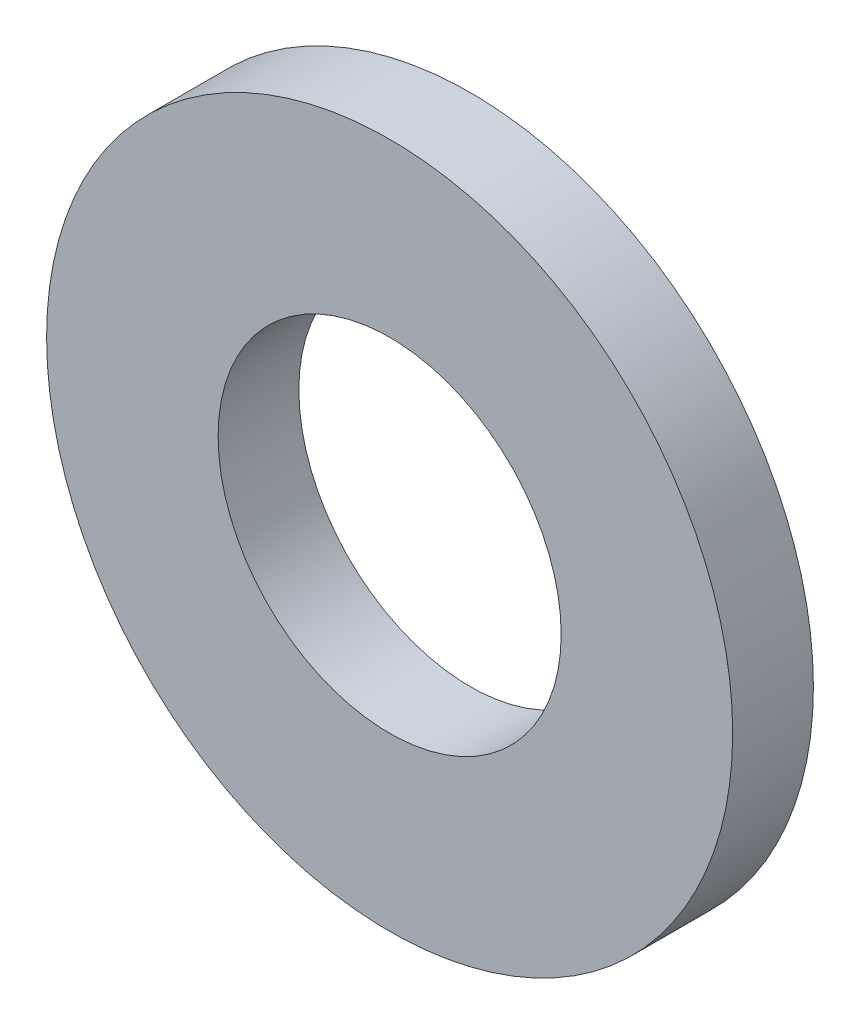
ISO-10303-21;
HEADER;
FILE_DESCRIPTION(('STEP AP214'),'2;1');
FILE_NAME('part.step','',(''),(''),'','','');
FILE_SCHEMA(('AUTOMOTIVE_DESIGN { 1 0 10303 214 1 1 1 1 }'));
ENDSEC;
DATA;
#1=APPLICATION_CONTEXT('core data for automotive mechanical design processes');
#2=APPLICATION_PROTOCOL_DEFINITION('international standard','automotive_design',2000,#1);
#3=PRODUCT_CONTEXT('',#1,'mechanical');
#4=PRODUCT('Part','Part','',(#3));
#5=PRODUCT_RELATED_PRODUCT_CATEGORY('part','',(#4));
#6=PRODUCT_DEFINITION_FORMATION('','',#4);
#7=PRODUCT_DEFINITION_CONTEXT('part definition',#1,'design');
#8=PRODUCT_DEFINITION('design','',#6,#7);
#9=PRODUCT_DEFINITION_SHAPE('','',#8);
#10=(LENGTH_UNIT() NAMED_UNIT(*) SI_UNIT(.MILLI.,.METRE.));
#11=(NAMED_UNIT(*) PLANE_ANGLE_UNIT() SI_UNIT($,.RADIAN.));
#12=(NAMED_UNIT(*) SI_UNIT($,.STERADIAN.) SOLID_ANGLE_UNIT());
#13=UNCERTAINTY_MEASURE_WITH_UNIT(LENGTH_MEASURE(1.E-05),#10,'distance_accuracy_value','');
#14=(GEOMETRIC_REPRESENTATION_CONTEXT(3) GLOBAL_UNCERTAINTY_ASSIGNED_CONTEXT((#13)) GLOBAL_UNIT_ASSIGNED_CONTEXT((#10,
#11,#12)) REPRESENTATION_CONTEXT('',''));
#15=CARTESIAN_POINT('',(0.,0.,0.));
#16=DIRECTION('',(0.,0.,1.));
#17=DIRECTION('',(1.,0.,0.));
#18=AXIS2_PLACEMENT_3D('',#15,#16,#17);
#19=CARTESIAN_POINT('',(0.,260.,2.));
#20=DIRECTION('',(0.,0.,1.));
#21=DIRECTION('',(1.,0.,0.));
#22=AXIS2_PLACEMENT_3D('',#19,#20,#21);
#23=PLANE('',#22);
#24=CARTESIAN_POINT('',(0.,260.,2.));
#25=DIRECTION('',(0.,0.,1.));
#26=DIRECTION('',(1.,0.,0.));
#27=AXIS2_PLACEMENT_3D('',#24,#25,#26);
#28=CIRCLE('',#27,8.5);
#29=CARTESIAN_POINT('',(8.5,260.,2.));
#30=VERTEX_POINT('',#29);
#31=EDGE_CURVE('E10',#30,#30,#28,.T.);
#32=ORIENTED_EDGE('',*,*,#31,.T.);
#33=EDGE_LOOP('',(#32));
#34=FACE_BOUND('',#33,.T.);
#35=CARTESIAN_POINT('',(0.,260.,2.));
#36=DIRECTION('',(0.,0.,1.));
#37=DIRECTION('',(1.,0.,0.));
#38=AXIS2_PLACEMENT_3D('',#35,#36,#37);
#39=CIRCLE('',#38,4.25);
#40=CARTESIAN_POINT('',(4.25,260.,2.));
#41=VERTEX_POINT('',#40);
#42=EDGE_CURVE('E41',#41,#41,#39,.T.);
#43=ORIENTED_EDGE('',*,*,#42,.F.);
#44=EDGE_LOOP('',(#43));
#45=FACE_BOUND('',#44,.T.);
#46=ADVANCED_FACE('F30',(#34,#45),#23,.T.);
#47=CARTESIAN_POINT('',(0.,260.,0.));
#48=DIRECTION('',(0.,0.,1.));
#49=DIRECTION('',(1.,0.,0.));
#50=AXIS2_PLACEMENT_3D('',#47,#48,#49);
#51=PLANE('',#50);
#52=CARTESIAN_POINT('',(0.,260.,0.));
#53=DIRECTION('',(0.,0.,1.));
#54=DIRECTION('',(1.,0.,0.));
#55=AXIS2_PLACEMENT_3D('',#52,#53,#54);
#56=CIRCLE('',#55,8.5);
#57=CARTESIAN_POINT('',(8.5,260.,0.));
#58=VERTEX_POINT('',#57);
#59=EDGE_CURVE('E34',#58,#58,#56,.T.);
#60=ORIENTED_EDGE('',*,*,#59,.F.);
#61=EDGE_LOOP('',(#60));
#62=FACE_BOUND('',#61,.T.);
#63=CARTESIAN_POINT('',(0.,260.,0.));
#64=DIRECTION('',(0.,0.,1.));
#65=DIRECTION('',(1.,0.,0.));
#66=AXIS2_PLACEMENT_3D('',#63,#64,#65);
#67=CIRCLE('',#66,4.25);
#68=CARTESIAN_POINT('',(4.25,260.,0.));
#69=VERTEX_POINT('',#68);
#70=EDGE_CURVE('E43',#69,#69,#67,.T.);
#71=ORIENTED_EDGE('',*,*,#70,.T.);
#72=EDGE_LOOP('',(#71));
#73=FACE_BOUND('',#72,.T.);
#74=ADVANCED_FACE('F53',(#62,#73),#51,.F.);
#75=CARTESIAN_POINT('',(0.,260.,2.));
#76=DIRECTION('',(0.,0.,-1.));
#77=DIRECTION('',(-1.,0.,0.));
#78=AXIS2_PLACEMENT_3D('',#75,#76,#77);
#79=CYLINDRICAL_SURFACE('',#78,8.5);
#80=ORIENTED_EDGE('',*,*,#31,.F.);
#81=EDGE_LOOP('',(#80));
#82=FACE_BOUND('',#81,.T.);
#83=ORIENTED_EDGE('',*,*,#59,.T.);
#84=EDGE_LOOP('',(#83));
#85=FACE_BOUND('',#84,.T.);
#86=ADVANCED_FACE('F32',(#82,#85),#79,.T.);
#87=CARTESIAN_POINT('',(0.,260.,2.));
#88=DIRECTION('',(0.,0.,-1.));
#89=DIRECTION('',(-1.,0.,0.));
#90=AXIS2_PLACEMENT_3D('',#87,#88,#89);
#91=CYLINDRICAL_SURFACE('',#90,4.25);
#92=ORIENTED_EDGE('',*,*,#42,.T.);
#93=EDGE_LOOP('',(#92));
#94=FACE_BOUND('',#93,.T.);
#95=ORIENTED_EDGE('',*,*,#70,.F.);
#96=EDGE_LOOP('',(#95));
#97=FACE_BOUND('',#96,.T.);
#98=ADVANCED_FACE('F49',(#94,#97),#91,.F.);
#99=CLOSED_SHELL('',(#46,#74,#86,#98));
#100=MANIFOLD_SOLID_BREP('B2',#99);
#101=ADVANCED_BREP_SHAPE_REPRESENTATION('',(#18,#100),#14);
#102=SHAPE_DEFINITION_REPRESENTATION(#9,#101);
ENDSEC;
END-ISO-10303-21;
